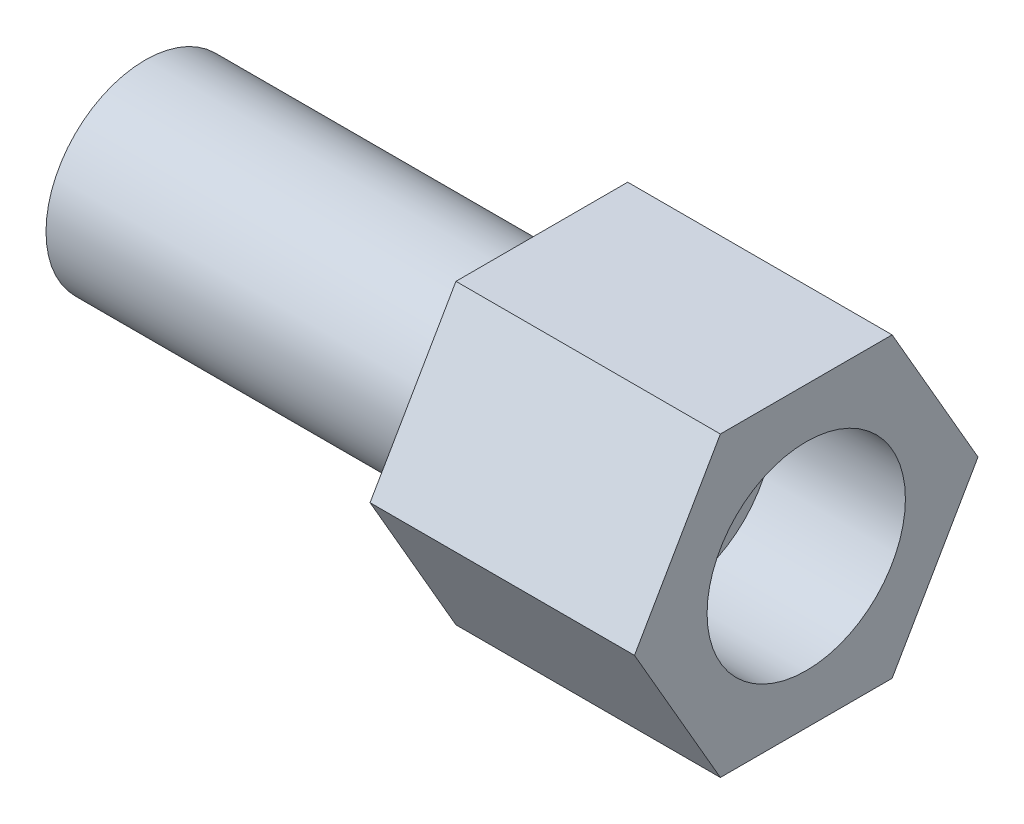
ISO-10303-21;
HEADER;
FILE_DESCRIPTION(('STEP AP214'),'2;1');
FILE_NAME('part.step','',(''),(''),'','','');
FILE_SCHEMA(('AUTOMOTIVE_DESIGN { 1 0 10303 214 1 1 1 1 }'));
ENDSEC;
DATA;
#1=APPLICATION_CONTEXT('core data for automotive mechanical design processes');
#2=APPLICATION_PROTOCOL_DEFINITION('international standard','automotive_design',2000,#1);
#3=PRODUCT_CONTEXT('',#1,'mechanical');
#4=PRODUCT('Part','Part','',(#3));
#5=PRODUCT_RELATED_PRODUCT_CATEGORY('part','',(#4));
#6=PRODUCT_DEFINITION_FORMATION('','',#4);
#7=PRODUCT_DEFINITION_CONTEXT('part definition',#1,'design');
#8=PRODUCT_DEFINITION('design','',#6,#7);
#9=PRODUCT_DEFINITION_SHAPE('','',#8);
#10=(LENGTH_UNIT() NAMED_UNIT(*) SI_UNIT(.MILLI.,.METRE.));
#11=(NAMED_UNIT(*) PLANE_ANGLE_UNIT() SI_UNIT($,.RADIAN.));
#12=(NAMED_UNIT(*) SI_UNIT($,.STERADIAN.) SOLID_ANGLE_UNIT());
#13=UNCERTAINTY_MEASURE_WITH_UNIT(LENGTH_MEASURE(1.E-05),#10,'distance_accuracy_value','');
#14=(GEOMETRIC_REPRESENTATION_CONTEXT(3) GLOBAL_UNCERTAINTY_ASSIGNED_CONTEXT((#13)) GLOBAL_UNIT_ASSIGNED_CONTEXT((#10,
#11,#12)) REPRESENTATION_CONTEXT('',''));
#15=CARTESIAN_POINT('',(0.,0.,0.));
#16=DIRECTION('',(0.,0.,1.));
#17=DIRECTION('',(1.,0.,0.));
#18=AXIS2_PLACEMENT_3D('',#15,#16,#17);
#19=CARTESIAN_POINT('',(6.,0.,0.));
#20=DIRECTION('',(-1.,0.,0.));
#21=DIRECTION('',(0.,0.,1.));
#22=AXIS2_PLACEMENT_3D('',#19,#20,#21);
#23=CYLINDRICAL_SURFACE('',#22,1.5);
#24=CARTESIAN_POINT('',(6.,0.,0.));
#25=DIRECTION('',(1.,0.,0.));
#26=DIRECTION('',(0.,0.,-1.));
#27=AXIS2_PLACEMENT_3D('',#24,#25,#26);
#28=CIRCLE('',#27,1.5);
#29=CARTESIAN_POINT('',(6.,0.,-1.5));
#30=VERTEX_POINT('',#29);
#31=EDGE_CURVE('E11',#30,#30,#28,.T.);
#32=ORIENTED_EDGE('',*,*,#31,.F.);
#33=EDGE_LOOP('',(#32));
#34=FACE_BOUND('',#33,.T.);
#35=CARTESIAN_POINT('',(0.,0.,0.));
#36=DIRECTION('',(1.,0.,0.));
#37=DIRECTION('',(0.,0.,-1.));
#38=AXIS2_PLACEMENT_3D('',#35,#36,#37);
#39=CIRCLE('',#38,1.5);
#40=CARTESIAN_POINT('',(0.,0.,-1.5));
#41=VERTEX_POINT('',#40);
#42=EDGE_CURVE('E48',#41,#41,#39,.T.);
#43=ORIENTED_EDGE('',*,*,#42,.T.);
#44=EDGE_LOOP('',(#43));
#45=FACE_BOUND('',#44,.T.);
#46=ADVANCED_FACE('F45',(#34,#45),#23,.T.);
#47=CARTESIAN_POINT('',(0.,0.,0.));
#48=DIRECTION('',(1.,0.,0.));
#49=DIRECTION('',(0.,0.,-1.));
#50=AXIS2_PLACEMENT_3D('',#47,#48,#49);
#51=PLANE('',#50);
#52=ORIENTED_EDGE('',*,*,#42,.F.);
#53=EDGE_LOOP('',(#52));
#54=FACE_BOUND('',#53,.T.);
#55=ADVANCED_FACE('F171',(#54),#51,.F.);
#56=CARTESIAN_POINT('',(10.,-2.25,-1.29903810567666));
#57=DIRECTION('',(0.,0.5,0.866025403784439));
#58=DIRECTION('',(0.,-0.866025403784439,0.5));
#59=AXIS2_PLACEMENT_3D('',#56,#57,#58);
#60=PLANE('',#59);
#61=DIRECTION('',(0.,0.866025403784439,-0.5));
#62=VECTOR('',#61,1.);
#63=CARTESIAN_POINT('',(6.,-2.25,-1.29903810567666));
#64=LINE('',#63,#62);
#65=CARTESIAN_POINT('',(6.,-2.25,-1.29903810567666));
#66=VERTEX_POINT('',#65);
#67=CARTESIAN_POINT('',(6.,0.,-2.59807621135332));
#68=VERTEX_POINT('',#67);
#69=EDGE_CURVE('E135',#66,#68,#64,.T.);
#70=ORIENTED_EDGE('',*,*,#69,.T.);
#71=DIRECTION('',(-1.,0.,0.));
#72=VECTOR('',#71,1.);
#73=CARTESIAN_POINT('',(10.,0.,-2.59807621135332));
#74=LINE('',#73,#72);
#75=CARTESIAN_POINT('',(10.,0.,-2.59807621135332));
#76=VERTEX_POINT('',#75);
#77=EDGE_CURVE('E163',#76,#68,#74,.T.);
#78=ORIENTED_EDGE('',*,*,#77,.F.);
#79=DIRECTION('',(0.,0.866025403784439,-0.5));
#80=VECTOR('',#79,1.);
#81=CARTESIAN_POINT('',(10.,-2.25,-1.29903810567666));
#82=LINE('',#81,#80);
#83=CARTESIAN_POINT('',(10.,-2.25,-1.29903810567666));
#84=VERTEX_POINT('',#83);
#85=EDGE_CURVE('E152',#84,#76,#82,.T.);
#86=ORIENTED_EDGE('',*,*,#85,.F.);
#87=DIRECTION('',(-1.,0.,0.));
#88=VECTOR('',#87,1.);
#89=CARTESIAN_POINT('',(10.,-2.25,-1.29903810567666));
#90=LINE('',#89,#88);
#91=EDGE_CURVE('E131',#84,#66,#90,.T.);
#92=ORIENTED_EDGE('',*,*,#91,.T.);
#93=EDGE_LOOP('',(#70,#78,#86,#92));
#94=FACE_BOUND('',#93,.T.);
#95=ADVANCED_FACE('F173',(#94),#60,.F.);
#96=CARTESIAN_POINT('',(10.,0.,-2.59807621135332));
#97=DIRECTION('',(0.,-0.5,0.866025403784438));
#98=DIRECTION('',(0.,-0.866025403784438,-0.5));
#99=AXIS2_PLACEMENT_3D('',#96,#97,#98);
#100=PLANE('',#99);
#101=DIRECTION('',(0.,0.866025403784438,0.5));
#102=VECTOR('',#101,1.);
#103=CARTESIAN_POINT('',(6.,0.,-2.59807621135332));
#104=LINE('',#103,#102);
#105=CARTESIAN_POINT('',(6.,2.25,-1.29903810567666));
#106=VERTEX_POINT('',#105);
#107=EDGE_CURVE('E139',#68,#106,#104,.T.);
#108=ORIENTED_EDGE('',*,*,#107,.T.);
#109=DIRECTION('',(-1.,0.,0.));
#110=VECTOR('',#109,1.);
#111=CARTESIAN_POINT('',(10.,2.25,-1.29903810567666));
#112=LINE('',#111,#110);
#113=CARTESIAN_POINT('',(10.,2.25,-1.29903810567666));
#114=VERTEX_POINT('',#113);
#115=EDGE_CURVE('E159',#114,#106,#112,.T.);
#116=ORIENTED_EDGE('',*,*,#115,.F.);
#117=DIRECTION('',(0.,0.866025403784438,0.5));
#118=VECTOR('',#117,1.);
#119=CARTESIAN_POINT('',(10.,0.,-2.59807621135332));
#120=LINE('',#119,#118);
#121=EDGE_CURVE('E100',#76,#114,#120,.T.);
#122=ORIENTED_EDGE('',*,*,#121,.F.);
#123=ORIENTED_EDGE('',*,*,#77,.T.);
#124=EDGE_LOOP('',(#108,#116,#122,#123));
#125=FACE_BOUND('',#124,.T.);
#126=ADVANCED_FACE('F178',(#125),#100,.F.);
#127=CARTESIAN_POINT('',(10.,2.25,-1.29903810567666));
#128=DIRECTION('',(0.,-1.,0.));
#129=DIRECTION('',(0.,0.,-1.));
#130=AXIS2_PLACEMENT_3D('',#127,#128,#129);
#131=PLANE('',#130);
#132=DIRECTION('',(0.,0.,1.));
#133=VECTOR('',#132,1.);
#134=CARTESIAN_POINT('',(6.,2.25,-1.29903810567666));
#135=LINE('',#134,#133);
#136=CARTESIAN_POINT('',(6.,2.25,1.29903810567666));
#137=VERTEX_POINT('',#136);
#138=EDGE_CURVE('E143',#106,#137,#135,.T.);
#139=ORIENTED_EDGE('',*,*,#138,.T.);
#140=DIRECTION('',(-1.,0.,0.));
#141=VECTOR('',#140,1.);
#142=CARTESIAN_POINT('',(10.,2.25,1.29903810567666));
#143=LINE('',#142,#141);
#144=CARTESIAN_POINT('',(10.,2.25,1.29903810567666));
#145=VERTEX_POINT('',#144);
#146=EDGE_CURVE('E124',#145,#137,#143,.T.);
#147=ORIENTED_EDGE('',*,*,#146,.F.);
#148=DIRECTION('',(0.,0.,1.));
#149=VECTOR('',#148,1.);
#150=CARTESIAN_POINT('',(10.,2.25,-1.29903810567666));
#151=LINE('',#150,#149);
#152=EDGE_CURVE('E113',#114,#145,#151,.T.);
#153=ORIENTED_EDGE('',*,*,#152,.F.);
#154=ORIENTED_EDGE('',*,*,#115,.T.);
#155=EDGE_LOOP('',(#139,#147,#153,#154));
#156=FACE_BOUND('',#155,.T.);
#157=ADVANCED_FACE('F185',(#156),#131,.F.);
#158=CARTESIAN_POINT('',(10.,2.25,1.29903810567666));
#159=DIRECTION('',(0.,-0.5,-0.866025403784439));
#160=DIRECTION('',(0.,0.866025403784439,-0.5));
#161=AXIS2_PLACEMENT_3D('',#158,#159,#160);
#162=PLANE('',#161);
#163=DIRECTION('',(0.,-0.866025403784439,0.5));
#164=VECTOR('',#163,1.);
#165=CARTESIAN_POINT('',(6.,2.25,1.29903810567666));
#166=LINE('',#165,#164);
#167=CARTESIAN_POINT('',(6.,0.,2.59807621135332));
#168=VERTEX_POINT('',#167);
#169=EDGE_CURVE('E122',#137,#168,#166,.T.);
#170=ORIENTED_EDGE('',*,*,#169,.T.);
#171=DIRECTION('',(-1.,0.,0.));
#172=VECTOR('',#171,1.);
#173=CARTESIAN_POINT('',(10.,0.,2.59807621135332));
#174=LINE('',#173,#172);
#175=CARTESIAN_POINT('',(10.,0.,2.59807621135332));
#176=VERTEX_POINT('',#175);
#177=EDGE_CURVE('E119',#176,#168,#174,.T.);
#178=ORIENTED_EDGE('',*,*,#177,.F.);
#179=DIRECTION('',(0.,-0.866025403784439,0.5));
#180=VECTOR('',#179,1.);
#181=CARTESIAN_POINT('',(10.,2.25,1.29903810567666));
#182=LINE('',#181,#180);
#183=EDGE_CURVE('E107',#145,#176,#182,.T.);
#184=ORIENTED_EDGE('',*,*,#183,.F.);
#185=ORIENTED_EDGE('',*,*,#146,.T.);
#186=EDGE_LOOP('',(#170,#178,#184,#185));
#187=FACE_BOUND('',#186,.T.);
#188=ADVANCED_FACE('F120',(#187),#162,.F.);
#189=CARTESIAN_POINT('',(10.,0.,2.59807621135332));
#190=DIRECTION('',(0.,0.5,-0.866025403784438));
#191=DIRECTION('',(0.,0.866025403784439,0.5));
#192=AXIS2_PLACEMENT_3D('',#189,#190,#191);
#193=PLANE('',#192);
#194=DIRECTION('',(0.,-0.866025403784438,-0.5));
#195=VECTOR('',#194,1.);
#196=CARTESIAN_POINT('',(6.,0.,2.59807621135332));
#197=LINE('',#196,#195);
#198=CARTESIAN_POINT('',(6.,-2.25,1.29903810567666));
#199=VERTEX_POINT('',#198);
#200=EDGE_CURVE('E85',#168,#199,#197,.T.);
#201=ORIENTED_EDGE('',*,*,#200,.T.);
#202=DIRECTION('',(-1.,0.,0.));
#203=VECTOR('',#202,1.);
#204=CARTESIAN_POINT('',(10.,-2.25,1.29903810567666));
#205=LINE('',#204,#203);
#206=CARTESIAN_POINT('',(10.,-2.25,1.29903810567666));
#207=VERTEX_POINT('',#206);
#208=EDGE_CURVE('E125',#207,#199,#205,.T.);
#209=ORIENTED_EDGE('',*,*,#208,.F.);
#210=DIRECTION('',(0.,-0.866025403784438,-0.5));
#211=VECTOR('',#210,1.);
#212=CARTESIAN_POINT('',(10.,0.,2.59807621135332));
#213=LINE('',#212,#211);
#214=EDGE_CURVE('E111',#176,#207,#213,.T.);
#215=ORIENTED_EDGE('',*,*,#214,.F.);
#216=ORIENTED_EDGE('',*,*,#177,.T.);
#217=EDGE_LOOP('',(#201,#209,#215,#216));
#218=FACE_BOUND('',#217,.T.);
#219=ADVANCED_FACE('F127',(#218),#193,.F.);
#220=CARTESIAN_POINT('',(10.,-2.25,1.29903810567666));
#221=DIRECTION('',(0.,1.,0.));
#222=DIRECTION('',(0.,0.,1.));
#223=AXIS2_PLACEMENT_3D('',#220,#221,#222);
#224=PLANE('',#223);
#225=DIRECTION('',(0.,0.,-1.));
#226=VECTOR('',#225,1.);
#227=CARTESIAN_POINT('',(6.,-2.25,1.29903810567666));
#228=LINE('',#227,#226);
#229=EDGE_CURVE('E91',#199,#66,#228,.T.);
#230=ORIENTED_EDGE('',*,*,#229,.T.);
#231=ORIENTED_EDGE('',*,*,#91,.F.);
#232=DIRECTION('',(0.,0.,-1.));
#233=VECTOR('',#232,1.);
#234=CARTESIAN_POINT('',(10.,-2.25,1.29903810567666));
#235=LINE('',#234,#233);
#236=EDGE_CURVE('E62',#207,#84,#235,.T.);
#237=ORIENTED_EDGE('',*,*,#236,.F.);
#238=ORIENTED_EDGE('',*,*,#208,.T.);
#239=EDGE_LOOP('',(#230,#231,#237,#238));
#240=FACE_BOUND('',#239,.T.);
#241=ADVANCED_FACE('F193',(#240),#224,.F.);
#242=CARTESIAN_POINT('',(10.,0.,0.));
#243=DIRECTION('',(1.,0.,0.));
#244=DIRECTION('',(0.,0.,-1.));
#245=AXIS2_PLACEMENT_3D('',#242,#243,#244);
#246=PLANE('',#245);
#247=CARTESIAN_POINT('',(10.,0.,0.));
#248=DIRECTION('',(1.,0.,0.));
#249=DIRECTION('',(0.,0.,-1.));
#250=AXIS2_PLACEMENT_3D('',#247,#248,#249);
#251=CIRCLE('',#250,1.5);
#252=CARTESIAN_POINT('',(10.,0.,-1.5));
#253=VERTEX_POINT('',#252);
#254=EDGE_CURVE('E215',#253,#253,#251,.T.);
#255=ORIENTED_EDGE('',*,*,#254,.F.);
#256=EDGE_LOOP('',(#255));
#257=FACE_BOUND('',#256,.T.);
#258=ORIENTED_EDGE('',*,*,#85,.T.);
#259=ORIENTED_EDGE('',*,*,#121,.T.);
#260=ORIENTED_EDGE('',*,*,#152,.T.);
#261=ORIENTED_EDGE('',*,*,#183,.T.);
#262=ORIENTED_EDGE('',*,*,#214,.T.);
#263=ORIENTED_EDGE('',*,*,#236,.T.);
#264=EDGE_LOOP('',(#258,#259,#260,#261,#262,#263));
#265=FACE_BOUND('',#264,.T.);
#266=ADVANCED_FACE('F109',(#257,#265),#246,.T.);
#267=CARTESIAN_POINT('',(6.,0.,0.));
#268=DIRECTION('',(1.,0.,0.));
#269=DIRECTION('',(0.,0.,-1.));
#270=AXIS2_PLACEMENT_3D('',#267,#268,#269);
#271=PLANE('',#270);
#272=ORIENTED_EDGE('',*,*,#31,.T.);
#273=EDGE_LOOP('',(#272));
#274=FACE_BOUND('',#273,.T.);
#275=ORIENTED_EDGE('',*,*,#69,.F.);
#276=ORIENTED_EDGE('',*,*,#229,.F.);
#277=ORIENTED_EDGE('',*,*,#200,.F.);
#278=ORIENTED_EDGE('',*,*,#169,.F.);
#279=ORIENTED_EDGE('',*,*,#138,.F.);
#280=ORIENTED_EDGE('',*,*,#107,.F.);
#281=EDGE_LOOP('',(#275,#276,#277,#278,#279,#280));
#282=FACE_BOUND('',#281,.T.);
#283=ADVANCED_FACE('F196',(#274,#282),#271,.F.);
#284=CARTESIAN_POINT('',(8.,0.,0.));
#285=DIRECTION('',(1.,0.,0.));
#286=DIRECTION('',(0.,0.,-1.));
#287=AXIS2_PLACEMENT_3D('',#284,#285,#286);
#288=CYLINDRICAL_SURFACE('',#287,1.5);
#289=CARTESIAN_POINT('',(8.,0.,0.));
#290=DIRECTION('',(1.,0.,0.));
#291=DIRECTION('',(0.,0.,-1.));
#292=AXIS2_PLACEMENT_3D('',#289,#290,#291);
#293=CIRCLE('',#292,1.5);
#294=CARTESIAN_POINT('',(8.,0.,-1.5));
#295=VERTEX_POINT('',#294);
#296=EDGE_CURVE('E140',#295,#295,#293,.T.);
#297=ORIENTED_EDGE('',*,*,#296,.F.);
#298=EDGE_LOOP('',(#297));
#299=FACE_BOUND('',#298,.T.);
#300=ORIENTED_EDGE('',*,*,#254,.T.);
#301=EDGE_LOOP('',(#300));
#302=FACE_BOUND('',#301,.T.);
#303=ADVANCED_FACE('F199',(#299,#302),#288,.F.);
#304=CARTESIAN_POINT('',(8.,0.,0.));
#305=DIRECTION('',(1.,0.,0.));
#306=DIRECTION('',(0.,0.,-1.));
#307=AXIS2_PLACEMENT_3D('',#304,#305,#306);
#308=PLANE('',#307);
#309=ORIENTED_EDGE('',*,*,#296,.T.);
#310=EDGE_LOOP('',(#309));
#311=FACE_BOUND('',#310,.T.);
#312=ADVANCED_FACE('F206',(#311),#308,.T.);
#313=CLOSED_SHELL('',(#46,#55,#95,#126,#157,#188,#219,#241,#266,#283,#303,#312));
#314=MANIFOLD_SOLID_BREP('B2',#313);
#315=ADVANCED_BREP_SHAPE_REPRESENTATION('',(#18,#314),#14);
#316=SHAPE_DEFINITION_REPRESENTATION(#9,#315);
ENDSEC;
END-ISO-10303-21;
